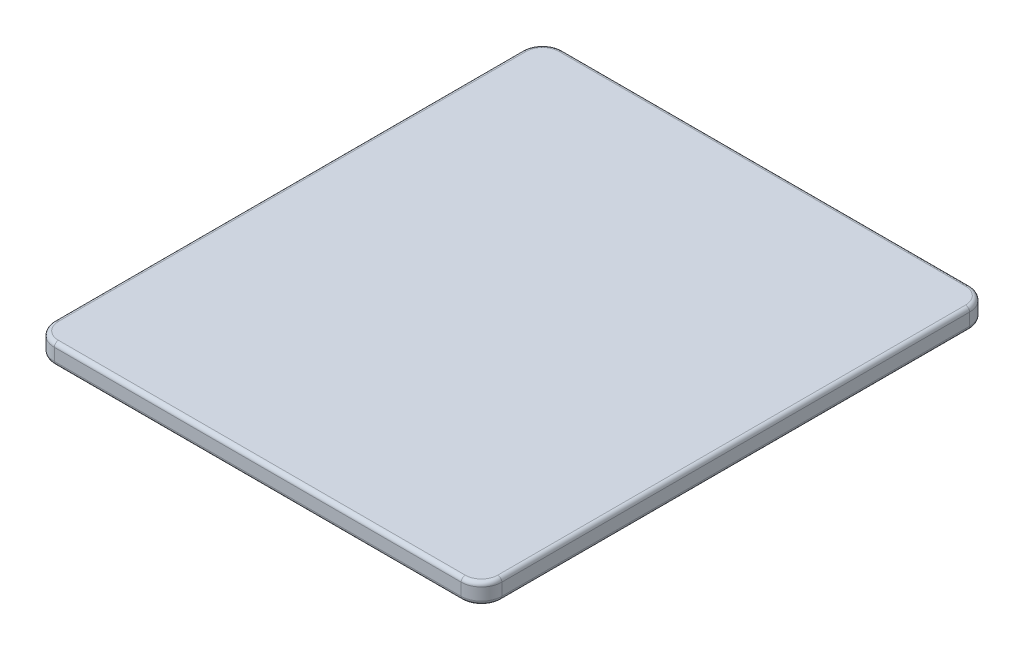
ISO-10303-21;
HEADER;
FILE_DESCRIPTION(('STEP AP214'),'2;1');
FILE_NAME('part.step','',(''),(''),'','','');
FILE_SCHEMA(('AUTOMOTIVE_DESIGN { 1 0 10303 214 1 1 1 1 }'));
ENDSEC;
DATA;
#1=APPLICATION_CONTEXT('core data for automotive mechanical design processes');
#2=APPLICATION_PROTOCOL_DEFINITION('international standard','automotive_design',2000,#1);
#3=PRODUCT_CONTEXT('',#1,'mechanical');
#4=PRODUCT('Part','Part','',(#3));
#5=PRODUCT_RELATED_PRODUCT_CATEGORY('part','',(#4));
#6=PRODUCT_DEFINITION_FORMATION('','',#4);
#7=PRODUCT_DEFINITION_CONTEXT('part definition',#1,'design');
#8=PRODUCT_DEFINITION('design','',#6,#7);
#9=PRODUCT_DEFINITION_SHAPE('','',#8);
#10=(LENGTH_UNIT() NAMED_UNIT(*) SI_UNIT(.MILLI.,.METRE.));
#11=(NAMED_UNIT(*) PLANE_ANGLE_UNIT() SI_UNIT($,.RADIAN.));
#12=(NAMED_UNIT(*) SI_UNIT($,.STERADIAN.) SOLID_ANGLE_UNIT());
#13=UNCERTAINTY_MEASURE_WITH_UNIT(LENGTH_MEASURE(1.E-05),#10,'distance_accuracy_value','');
#14=(GEOMETRIC_REPRESENTATION_CONTEXT(3) GLOBAL_UNCERTAINTY_ASSIGNED_CONTEXT((#13)) GLOBAL_UNIT_ASSIGNED_CONTEXT((#10,
#11,#12)) REPRESENTATION_CONTEXT('',''));
#15=CARTESIAN_POINT('',(0.,0.,0.));
#16=DIRECTION('',(0.,0.,1.));
#17=DIRECTION('',(1.,0.,0.));
#18=AXIS2_PLACEMENT_3D('',#15,#16,#17);
#19=CARTESIAN_POINT('',(-5.5,0.5,-6.25));
#20=DIRECTION('',(1.,0.,0.));
#21=DIRECTION('',(0.,0.,-1.));
#22=AXIS2_PLACEMENT_3D('',#19,#20,#21);
#23=PLANE('',#22);
#24=DIRECTION('',(0.,-1.,0.));
#25=VECTOR('',#24,1.);
#26=CARTESIAN_POINT('',(-5.5,0.5,5.75));
#27=LINE('',#26,#25);
#28=CARTESIAN_POINT('',(-5.5,0.1,5.75));
#29=VERTEX_POINT('',#28);
#30=CARTESIAN_POINT('',(-5.5,0.4,5.75));
#31=VERTEX_POINT('',#30);
#32=EDGE_CURVE('E238',#29,#31,#27,.F.);
#33=ORIENTED_EDGE('',*,*,#32,.T.);
#34=DIRECTION('',(0.,0.,1.));
#35=VECTOR('',#34,1.);
#36=CARTESIAN_POINT('',(-5.5,0.4,-5.75));
#37=LINE('',#36,#35);
#38=CARTESIAN_POINT('',(-5.5,0.4,-5.75));
#39=VERTEX_POINT('',#38);
#40=EDGE_CURVE('E184',#31,#39,#37,.F.);
#41=ORIENTED_EDGE('',*,*,#40,.T.);
#42=DIRECTION('',(0.,-1.,0.));
#43=VECTOR('',#42,1.);
#44=CARTESIAN_POINT('',(-5.5,0.5,-5.75));
#45=LINE('',#44,#43);
#46=CARTESIAN_POINT('',(-5.5,0.1,-5.75));
#47=VERTEX_POINT('',#46);
#48=EDGE_CURVE('E285',#39,#47,#45,.T.);
#49=ORIENTED_EDGE('',*,*,#48,.T.);
#50=DIRECTION('',(0.,0.,1.));
#51=VECTOR('',#50,1.);
#52=CARTESIAN_POINT('',(-5.5,0.1,-6.25));
#53=LINE('',#52,#51);
#54=EDGE_CURVE('E182',#47,#29,#53,.T.);
#55=ORIENTED_EDGE('',*,*,#54,.T.);
#56=EDGE_LOOP('',(#33,#41,#49,#55));
#57=FACE_BOUND('',#56,.T.);
#58=ADVANCED_FACE('F33',(#57),#23,.F.);
#59=CARTESIAN_POINT('',(-5.5,0.5,6.25));
#60=DIRECTION('',(0.,0.,-1.));
#61=DIRECTION('',(-1.,0.,0.));
#62=AXIS2_PLACEMENT_3D('',#59,#60,#61);
#63=PLANE('',#62);
#64=DIRECTION('',(0.,-1.,0.));
#65=VECTOR('',#64,1.);
#66=CARTESIAN_POINT('',(-5.,0.5,6.25));
#67=LINE('',#66,#65);
#68=CARTESIAN_POINT('',(-5.,0.4,6.25));
#69=VERTEX_POINT('',#68);
#70=CARTESIAN_POINT('',(-5.,0.1,6.25));
#71=VERTEX_POINT('',#70);
#72=EDGE_CURVE('E167',#69,#71,#67,.T.);
#73=ORIENTED_EDGE('',*,*,#72,.T.);
#74=DIRECTION('',(1.,0.,0.));
#75=VECTOR('',#74,1.);
#76=CARTESIAN_POINT('',(-5.5,0.1,6.25));
#77=LINE('',#76,#75);
#78=CARTESIAN_POINT('',(5.,0.1,6.25));
#79=VERTEX_POINT('',#78);
#80=EDGE_CURVE('E11',#71,#79,#77,.T.);
#81=ORIENTED_EDGE('',*,*,#80,.T.);
#82=DIRECTION('',(0.,-1.,0.));
#83=VECTOR('',#82,1.);
#84=CARTESIAN_POINT('',(5.,0.5,6.25));
#85=LINE('',#84,#83);
#86=CARTESIAN_POINT('',(5.,0.4,6.25));
#87=VERTEX_POINT('',#86);
#88=EDGE_CURVE('E296',#79,#87,#85,.F.);
#89=ORIENTED_EDGE('',*,*,#88,.T.);
#90=DIRECTION('',(1.,0.,0.));
#91=VECTOR('',#90,1.);
#92=CARTESIAN_POINT('',(-5.,0.4,6.25));
#93=LINE('',#92,#91);
#94=EDGE_CURVE('E42',#87,#69,#93,.F.);
#95=ORIENTED_EDGE('',*,*,#94,.T.);
#96=EDGE_LOOP('',(#73,#81,#89,#95));
#97=FACE_BOUND('',#96,.T.);
#98=ADVANCED_FACE('F336',(#97),#63,.F.);
#99=CARTESIAN_POINT('',(5.5,0.5,-6.25));
#100=DIRECTION('',(-1.,0.,0.));
#101=DIRECTION('',(0.,0.,1.));
#102=AXIS2_PLACEMENT_3D('',#99,#100,#101);
#103=PLANE('',#102);
#104=DIRECTION('',(0.,-1.,0.));
#105=VECTOR('',#104,1.);
#106=CARTESIAN_POINT('',(5.5,0.5,-5.75));
#107=LINE('',#106,#105);
#108=CARTESIAN_POINT('',(5.5,0.1,-5.75));
#109=VERTEX_POINT('',#108);
#110=CARTESIAN_POINT('',(5.5,0.4,-5.75));
#111=VERTEX_POINT('',#110);
#112=EDGE_CURVE('E278',#109,#111,#107,.F.);
#113=ORIENTED_EDGE('',*,*,#112,.T.);
#114=DIRECTION('',(0.,0.,-1.));
#115=VECTOR('',#114,1.);
#116=CARTESIAN_POINT('',(5.5,0.4,5.75));
#117=LINE('',#116,#115);
#118=CARTESIAN_POINT('',(5.5,0.4,5.75));
#119=VERTEX_POINT('',#118);
#120=EDGE_CURVE('E200',#111,#119,#117,.F.);
#121=ORIENTED_EDGE('',*,*,#120,.T.);
#122=DIRECTION('',(0.,-1.,0.));
#123=VECTOR('',#122,1.);
#124=CARTESIAN_POINT('',(5.5,0.5,5.75));
#125=LINE('',#124,#123);
#126=CARTESIAN_POINT('',(5.5,0.1,5.75));
#127=VERTEX_POINT('',#126);
#128=EDGE_CURVE('E287',#119,#127,#125,.T.);
#129=ORIENTED_EDGE('',*,*,#128,.T.);
#130=DIRECTION('',(0.,0.,-1.));
#131=VECTOR('',#130,1.);
#132=CARTESIAN_POINT('',(5.5,0.1,-6.25));
#133=LINE('',#132,#131);
#134=EDGE_CURVE('E198',#127,#109,#133,.T.);
#135=ORIENTED_EDGE('',*,*,#134,.T.);
#136=EDGE_LOOP('',(#113,#121,#129,#135));
#137=FACE_BOUND('',#136,.T.);
#138=ADVANCED_FACE('F369',(#137),#103,.F.);
#139=CARTESIAN_POINT('',(-5.5,0.5,-6.25));
#140=DIRECTION('',(0.,0.,1.));
#141=DIRECTION('',(1.,0.,0.));
#142=AXIS2_PLACEMENT_3D('',#139,#140,#141);
#143=PLANE('',#142);
#144=DIRECTION('',(0.,-1.,0.));
#145=VECTOR('',#144,1.);
#146=CARTESIAN_POINT('',(-5.,0.5,-6.25));
#147=LINE('',#146,#145);
#148=CARTESIAN_POINT('',(-5.,0.1,-6.25));
#149=VERTEX_POINT('',#148);
#150=CARTESIAN_POINT('',(-5.,0.4,-6.25));
#151=VERTEX_POINT('',#150);
#152=EDGE_CURVE('E284',#149,#151,#147,.F.);
#153=ORIENTED_EDGE('',*,*,#152,.T.);
#154=DIRECTION('',(-1.,0.,0.));
#155=VECTOR('',#154,1.);
#156=CARTESIAN_POINT('',(5.,0.4,-6.25));
#157=LINE('',#156,#155);
#158=CARTESIAN_POINT('',(5.,0.4,-6.25));
#159=VERTEX_POINT('',#158);
#160=EDGE_CURVE('E192',#151,#159,#157,.F.);
#161=ORIENTED_EDGE('',*,*,#160,.T.);
#162=DIRECTION('',(0.,-1.,0.));
#163=VECTOR('',#162,1.);
#164=CARTESIAN_POINT('',(5.,0.5,-6.25));
#165=LINE('',#164,#163);
#166=CARTESIAN_POINT('',(5.,0.1,-6.25));
#167=VERTEX_POINT('',#166);
#168=EDGE_CURVE('E275',#159,#167,#165,.T.);
#169=ORIENTED_EDGE('',*,*,#168,.T.);
#170=DIRECTION('',(-1.,0.,0.));
#171=VECTOR('',#170,1.);
#172=CARTESIAN_POINT('',(-5.5,0.1,-6.25));
#173=LINE('',#172,#171);
#174=EDGE_CURVE('E190',#167,#149,#173,.T.);
#175=ORIENTED_EDGE('',*,*,#174,.T.);
#176=EDGE_LOOP('',(#153,#161,#169,#175));
#177=FACE_BOUND('',#176,.T.);
#178=ADVANCED_FACE('F281',(#177),#143,.F.);
#179=CARTESIAN_POINT('',(0.,0.5,0.));
#180=DIRECTION('',(0.,1.,0.));
#181=DIRECTION('',(0.,0.,1.));
#182=AXIS2_PLACEMENT_3D('',#179,#180,#181);
#183=PLANE('',#182);
#184=DIRECTION('',(0.,0.,1.));
#185=VECTOR('',#184,1.);
#186=CARTESIAN_POINT('',(-5.4,0.5,5.75));
#187=LINE('',#186,#185);
#188=CARTESIAN_POINT('',(-5.4,0.5,-5.75));
#189=VERTEX_POINT('',#188);
#190=CARTESIAN_POINT('',(-5.4,0.5,5.75));
#191=VERTEX_POINT('',#190);
#192=EDGE_CURVE('E171',#189,#191,#187,.T.);
#193=ORIENTED_EDGE('',*,*,#192,.T.);
#194=CARTESIAN_POINT('',(-5.,0.5,5.75));
#195=DIRECTION('',(0.,1.,0.));
#196=DIRECTION('',(0.,0.,1.));
#197=AXIS2_PLACEMENT_3D('',#194,#195,#196);
#198=CIRCLE('',#197,0.4);
#199=CARTESIAN_POINT('',(-5.,0.5,6.15));
#200=VERTEX_POINT('',#199);
#201=EDGE_CURVE('E152',#191,#200,#198,.T.);
#202=ORIENTED_EDGE('',*,*,#201,.T.);
#203=DIRECTION('',(1.,0.,0.));
#204=VECTOR('',#203,1.);
#205=CARTESIAN_POINT('',(5.,0.5,6.15));
#206=LINE('',#205,#204);
#207=CARTESIAN_POINT('',(5.,0.5,6.15));
#208=VERTEX_POINT('',#207);
#209=EDGE_CURVE('E160',#200,#208,#206,.T.);
#210=ORIENTED_EDGE('',*,*,#209,.T.);
#211=CARTESIAN_POINT('',(5.,0.5,5.75));
#212=DIRECTION('',(0.,1.,0.));
#213=DIRECTION('',(0.,0.,1.));
#214=AXIS2_PLACEMENT_3D('',#211,#212,#213);
#215=CIRCLE('',#214,0.4);
#216=CARTESIAN_POINT('',(5.4,0.5,5.75));
#217=VERTEX_POINT('',#216);
#218=EDGE_CURVE('E166',#208,#217,#215,.T.);
#219=ORIENTED_EDGE('',*,*,#218,.T.);
#220=DIRECTION('',(0.,0.,-1.));
#221=VECTOR('',#220,1.);
#222=CARTESIAN_POINT('',(5.4,0.5,-5.75));
#223=LINE('',#222,#221);
#224=CARTESIAN_POINT('',(5.4,0.5,-5.75));
#225=VERTEX_POINT('',#224);
#226=EDGE_CURVE('E302',#217,#225,#223,.T.);
#227=ORIENTED_EDGE('',*,*,#226,.T.);
#228=CARTESIAN_POINT('',(5.,0.5,-5.75));
#229=DIRECTION('',(0.,1.,0.));
#230=DIRECTION('',(0.,0.,1.));
#231=AXIS2_PLACEMENT_3D('',#228,#229,#230);
#232=CIRCLE('',#231,0.4);
#233=CARTESIAN_POINT('',(5.,0.5,-6.15));
#234=VERTEX_POINT('',#233);
#235=EDGE_CURVE('E304',#225,#234,#232,.T.);
#236=ORIENTED_EDGE('',*,*,#235,.T.);
#237=DIRECTION('',(-1.,0.,0.));
#238=VECTOR('',#237,1.);
#239=CARTESIAN_POINT('',(-5.,0.5,-6.15));
#240=LINE('',#239,#238);
#241=CARTESIAN_POINT('',(-5.,0.5,-6.15));
#242=VERTEX_POINT('',#241);
#243=EDGE_CURVE('E306',#234,#242,#240,.T.);
#244=ORIENTED_EDGE('',*,*,#243,.T.);
#245=CARTESIAN_POINT('',(-5.,0.5,-5.75));
#246=DIRECTION('',(0.,1.,0.));
#247=DIRECTION('',(0.,0.,1.));
#248=AXIS2_PLACEMENT_3D('',#245,#246,#247);
#249=CIRCLE('',#248,0.4);
#250=EDGE_CURVE('E177',#242,#189,#249,.T.);
#251=ORIENTED_EDGE('',*,*,#250,.T.);
#252=EDGE_LOOP('',(#193,#202,#210,#219,#227,#236,#244,#251));
#253=FACE_BOUND('',#252,.T.);
#254=ADVANCED_FACE('F169',(#253),#183,.T.);
#255=CARTESIAN_POINT('',(0.,0.,0.));
#256=DIRECTION('',(0.,1.,0.));
#257=DIRECTION('',(0.,0.,1.));
#258=AXIS2_PLACEMENT_3D('',#255,#256,#257);
#259=PLANE('',#258);
#260=DIRECTION('',(1.,0.,0.));
#261=VECTOR('',#260,1.);
#262=CARTESIAN_POINT('',(0.,0.,6.15));
#263=LINE('',#262,#261);
#264=CARTESIAN_POINT('',(5.,0.,6.15));
#265=VERTEX_POINT('',#264);
#266=CARTESIAN_POINT('',(-5.,0.,6.15));
#267=VERTEX_POINT('',#266);
#268=EDGE_CURVE('E50',#265,#267,#263,.F.);
#269=ORIENTED_EDGE('',*,*,#268,.T.);
#270=CARTESIAN_POINT('',(-5.,0.,5.75));
#271=DIRECTION('',(0.,1.,0.));
#272=DIRECTION('',(0.,0.,1.));
#273=AXIS2_PLACEMENT_3D('',#270,#271,#272);
#274=CIRCLE('',#273,0.4);
#275=CARTESIAN_POINT('',(-5.4,0.,5.75));
#276=VERTEX_POINT('',#275);
#277=EDGE_CURVE('E218',#267,#276,#274,.F.);
#278=ORIENTED_EDGE('',*,*,#277,.T.);
#279=DIRECTION('',(0.,0.,1.));
#280=VECTOR('',#279,1.);
#281=CARTESIAN_POINT('',(-5.4,0.,0.));
#282=LINE('',#281,#280);
#283=CARTESIAN_POINT('',(-5.4,0.,-5.75));
#284=VERTEX_POINT('',#283);
#285=EDGE_CURVE('E206',#276,#284,#282,.F.);
#286=ORIENTED_EDGE('',*,*,#285,.T.);
#287=CARTESIAN_POINT('',(-5.,0.,-5.75));
#288=DIRECTION('',(0.,1.,0.));
#289=DIRECTION('',(0.,0.,1.));
#290=AXIS2_PLACEMENT_3D('',#287,#288,#289);
#291=CIRCLE('',#290,0.4);
#292=CARTESIAN_POINT('',(-5.,0.,-6.15));
#293=VERTEX_POINT('',#292);
#294=EDGE_CURVE('E208',#284,#293,#291,.F.);
#295=ORIENTED_EDGE('',*,*,#294,.T.);
#296=DIRECTION('',(-1.,0.,0.));
#297=VECTOR('',#296,1.);
#298=CARTESIAN_POINT('',(0.,0.,-6.15));
#299=LINE('',#298,#297);
#300=CARTESIAN_POINT('',(5.,0.,-6.15));
#301=VERTEX_POINT('',#300);
#302=EDGE_CURVE('E210',#293,#301,#299,.F.);
#303=ORIENTED_EDGE('',*,*,#302,.T.);
#304=CARTESIAN_POINT('',(5.,0.,-5.75));
#305=DIRECTION('',(0.,1.,0.));
#306=DIRECTION('',(0.,0.,1.));
#307=AXIS2_PLACEMENT_3D('',#304,#305,#306);
#308=CIRCLE('',#307,0.4);
#309=CARTESIAN_POINT('',(5.4,0.,-5.75));
#310=VERTEX_POINT('',#309);
#311=EDGE_CURVE('E212',#301,#310,#308,.F.);
#312=ORIENTED_EDGE('',*,*,#311,.T.);
#313=DIRECTION('',(0.,0.,-1.));
#314=VECTOR('',#313,1.);
#315=CARTESIAN_POINT('',(5.4,0.,0.));
#316=LINE('',#315,#314);
#317=CARTESIAN_POINT('',(5.4,0.,5.75));
#318=VERTEX_POINT('',#317);
#319=EDGE_CURVE('E214',#310,#318,#316,.F.);
#320=ORIENTED_EDGE('',*,*,#319,.T.);
#321=CARTESIAN_POINT('',(5.,0.,5.75));
#322=DIRECTION('',(0.,1.,0.));
#323=DIRECTION('',(0.,0.,1.));
#324=AXIS2_PLACEMENT_3D('',#321,#322,#323);
#325=CIRCLE('',#324,0.4);
#326=EDGE_CURVE('E55',#318,#265,#325,.F.);
#327=ORIENTED_EDGE('',*,*,#326,.T.);
#328=EDGE_LOOP('',(#269,#278,#286,#295,#303,#312,#320,#327));
#329=FACE_BOUND('',#328,.T.);
#330=ADVANCED_FACE('F376',(#329),#259,.F.);
#331=CARTESIAN_POINT('',(-5.,0.5,-5.75));
#332=DIRECTION('',(0.,-1.,0.));
#333=DIRECTION('',(0.,0.,-1.));
#334=AXIS2_PLACEMENT_3D('',#331,#332,#333);
#335=CYLINDRICAL_SURFACE('',#334,0.5);
#336=ORIENTED_EDGE('',*,*,#48,.F.);
#337=CARTESIAN_POINT('',(-5.,0.4,-5.75));
#338=DIRECTION('',(0.,1.,0.));
#339=DIRECTION('',(0.,0.,1.));
#340=AXIS2_PLACEMENT_3D('',#337,#338,#339);
#341=CIRCLE('',#340,0.5);
#342=EDGE_CURVE('E188',#39,#151,#341,.F.);
#343=ORIENTED_EDGE('',*,*,#342,.T.);
#344=ORIENTED_EDGE('',*,*,#152,.F.);
#345=CARTESIAN_POINT('',(-5.,0.1,-5.75));
#346=DIRECTION('',(0.,1.,0.));
#347=DIRECTION('',(0.,0.,1.));
#348=AXIS2_PLACEMENT_3D('',#345,#346,#347);
#349=CIRCLE('',#348,0.5);
#350=EDGE_CURVE('E186',#149,#47,#349,.T.);
#351=ORIENTED_EDGE('',*,*,#350,.T.);
#352=EDGE_LOOP('',(#336,#343,#344,#351));
#353=FACE_BOUND('',#352,.T.);
#354=ADVANCED_FACE('F373',(#353),#335,.T.);
#355=CARTESIAN_POINT('',(5.,0.5,-5.75));
#356=DIRECTION('',(0.,-1.,0.));
#357=DIRECTION('',(0.,0.,-1.));
#358=AXIS2_PLACEMENT_3D('',#355,#356,#357);
#359=CYLINDRICAL_SURFACE('',#358,0.5);
#360=ORIENTED_EDGE('',*,*,#168,.F.);
#361=CARTESIAN_POINT('',(5.,0.4,-5.75));
#362=DIRECTION('',(0.,1.,0.));
#363=DIRECTION('',(0.,0.,1.));
#364=AXIS2_PLACEMENT_3D('',#361,#362,#363);
#365=CIRCLE('',#364,0.5);
#366=EDGE_CURVE('E196',#159,#111,#365,.F.);
#367=ORIENTED_EDGE('',*,*,#366,.T.);
#368=ORIENTED_EDGE('',*,*,#112,.F.);
#369=CARTESIAN_POINT('',(5.,0.1,-5.75));
#370=DIRECTION('',(0.,1.,0.));
#371=DIRECTION('',(0.,0.,1.));
#372=AXIS2_PLACEMENT_3D('',#369,#370,#371);
#373=CIRCLE('',#372,0.5);
#374=EDGE_CURVE('E194',#109,#167,#373,.T.);
#375=ORIENTED_EDGE('',*,*,#374,.T.);
#376=EDGE_LOOP('',(#360,#367,#368,#375));
#377=FACE_BOUND('',#376,.T.);
#378=ADVANCED_FACE('F274',(#377),#359,.T.);
#379=CARTESIAN_POINT('',(-5.,0.5,5.75));
#380=DIRECTION('',(0.,-1.,0.));
#381=DIRECTION('',(0.,0.,-1.));
#382=AXIS2_PLACEMENT_3D('',#379,#380,#381);
#383=CYLINDRICAL_SURFACE('',#382,0.5);
#384=ORIENTED_EDGE('',*,*,#72,.F.);
#385=CARTESIAN_POINT('',(-5.,0.4,5.75));
#386=DIRECTION('',(0.,1.,0.));
#387=DIRECTION('',(0.,0.,1.));
#388=AXIS2_PLACEMENT_3D('',#385,#386,#387);
#389=CIRCLE('',#388,0.5);
#390=EDGE_CURVE('E154',#69,#31,#389,.F.);
#391=ORIENTED_EDGE('',*,*,#390,.T.);
#392=ORIENTED_EDGE('',*,*,#32,.F.);
#393=CARTESIAN_POINT('',(-5.,0.1,5.75));
#394=DIRECTION('',(0.,1.,0.));
#395=DIRECTION('',(0.,0.,1.));
#396=AXIS2_PLACEMENT_3D('',#393,#394,#395);
#397=CIRCLE('',#396,0.5);
#398=EDGE_CURVE('E173',#29,#71,#397,.T.);
#399=ORIENTED_EDGE('',*,*,#398,.T.);
#400=EDGE_LOOP('',(#384,#391,#392,#399));
#401=FACE_BOUND('',#400,.T.);
#402=ADVANCED_FACE('F323',(#401),#383,.T.);
#403=CARTESIAN_POINT('',(5.,0.5,5.75));
#404=DIRECTION('',(0.,-1.,0.));
#405=DIRECTION('',(0.,0.,-1.));
#406=AXIS2_PLACEMENT_3D('',#403,#404,#405);
#407=CYLINDRICAL_SURFACE('',#406,0.5);
#408=ORIENTED_EDGE('',*,*,#128,.F.);
#409=CARTESIAN_POINT('',(5.,0.4,5.75));
#410=DIRECTION('',(0.,1.,0.));
#411=DIRECTION('',(0.,0.,1.));
#412=AXIS2_PLACEMENT_3D('',#409,#410,#411);
#413=CIRCLE('',#412,0.5);
#414=EDGE_CURVE('E204',#119,#87,#413,.F.);
#415=ORIENTED_EDGE('',*,*,#414,.T.);
#416=ORIENTED_EDGE('',*,*,#88,.F.);
#417=CARTESIAN_POINT('',(5.,0.1,5.75));
#418=DIRECTION('',(0.,1.,0.));
#419=DIRECTION('',(0.,0.,1.));
#420=AXIS2_PLACEMENT_3D('',#417,#418,#419);
#421=CIRCLE('',#420,0.5);
#422=EDGE_CURVE('E202',#79,#127,#421,.T.);
#423=ORIENTED_EDGE('',*,*,#422,.T.);
#424=EDGE_LOOP('',(#408,#415,#416,#423));
#425=FACE_BOUND('',#424,.T.);
#426=ADVANCED_FACE('F362',(#425),#407,.T.);
#427=CARTESIAN_POINT('',(5.,0.4,-5.75));
#428=DIRECTION('',(0.,1.,0.));
#429=DIRECTION('',(0.,0.,1.));
#430=AXIS2_PLACEMENT_3D('',#427,#428,#429);
#431=TOROIDAL_SURFACE('',#430,0.4,0.1);
#432=CARTESIAN_POINT('',(5.4,0.4,-5.75));
#433=DIRECTION('',(0.,0.,1.));
#434=DIRECTION('',(1.,0.,0.));
#435=AXIS2_PLACEMENT_3D('',#432,#433,#434);
#436=CIRCLE('',#435,0.1);
#437=EDGE_CURVE('E232',#111,#225,#436,.T.);
#438=ORIENTED_EDGE('',*,*,#437,.F.);
#439=ORIENTED_EDGE('',*,*,#366,.F.);
#440=CARTESIAN_POINT('',(5.,0.4,-6.15));
#441=DIRECTION('',(-1.,0.,0.));
#442=DIRECTION('',(0.,0.,1.));
#443=AXIS2_PLACEMENT_3D('',#440,#441,#442);
#444=CIRCLE('',#443,0.1);
#445=EDGE_CURVE('E235',#234,#159,#444,.T.);
#446=ORIENTED_EDGE('',*,*,#445,.F.);
#447=ORIENTED_EDGE('',*,*,#235,.F.);
#448=EDGE_LOOP('',(#438,#439,#446,#447));
#449=FACE_BOUND('',#448,.T.);
#450=ADVANCED_FACE('F351',(#449),#431,.T.);
#451=CARTESIAN_POINT('',(0.,0.4,-6.15));
#452=DIRECTION('',(1.,0.,0.));
#453=DIRECTION('',(0.,0.,-1.));
#454=AXIS2_PLACEMENT_3D('',#451,#452,#453);
#455=CYLINDRICAL_SURFACE('',#454,0.1);
#456=ORIENTED_EDGE('',*,*,#445,.T.);
#457=ORIENTED_EDGE('',*,*,#160,.F.);
#458=CARTESIAN_POINT('',(-5.,0.4,-6.15));
#459=DIRECTION('',(-1.,0.,0.));
#460=DIRECTION('',(0.,0.,1.));
#461=AXIS2_PLACEMENT_3D('',#458,#459,#460);
#462=CIRCLE('',#461,0.1);
#463=EDGE_CURVE('E229',#242,#151,#462,.T.);
#464=ORIENTED_EDGE('',*,*,#463,.F.);
#465=ORIENTED_EDGE('',*,*,#243,.F.);
#466=EDGE_LOOP('',(#456,#457,#464,#465));
#467=FACE_BOUND('',#466,.T.);
#468=ADVANCED_FACE('F354',(#467),#455,.T.);
#469=CARTESIAN_POINT('',(5.4,0.4,0.));
#470=DIRECTION('',(0.,0.,1.));
#471=DIRECTION('',(1.,0.,0.));
#472=AXIS2_PLACEMENT_3D('',#469,#470,#471);
#473=CYLINDRICAL_SURFACE('',#472,0.1);
#474=ORIENTED_EDGE('',*,*,#437,.T.);
#475=ORIENTED_EDGE('',*,*,#226,.F.);
#476=CARTESIAN_POINT('',(5.4,0.4,5.75));
#477=DIRECTION('',(0.,0.,1.));
#478=DIRECTION('',(1.,0.,0.));
#479=AXIS2_PLACEMENT_3D('',#476,#477,#478);
#480=CIRCLE('',#479,0.1);
#481=EDGE_CURVE('E226',#119,#217,#480,.T.);
#482=ORIENTED_EDGE('',*,*,#481,.F.);
#483=ORIENTED_EDGE('',*,*,#120,.F.);
#484=EDGE_LOOP('',(#474,#475,#482,#483));
#485=FACE_BOUND('',#484,.T.);
#486=ADVANCED_FACE('F347',(#485),#473,.T.);
#487=CARTESIAN_POINT('',(-5.,0.4,-5.75));
#488=DIRECTION('',(0.,1.,0.));
#489=DIRECTION('',(0.,0.,1.));
#490=AXIS2_PLACEMENT_3D('',#487,#488,#489);
#491=TOROIDAL_SURFACE('',#490,0.4,0.1);
#492=ORIENTED_EDGE('',*,*,#463,.T.);
#493=ORIENTED_EDGE('',*,*,#342,.F.);
#494=CARTESIAN_POINT('',(-5.4,0.4,-5.75));
#495=DIRECTION('',(0.,0.,1.));
#496=DIRECTION('',(1.,0.,0.));
#497=AXIS2_PLACEMENT_3D('',#494,#495,#496);
#498=CIRCLE('',#497,0.1);
#499=EDGE_CURVE('E223',#189,#39,#498,.T.);
#500=ORIENTED_EDGE('',*,*,#499,.F.);
#501=ORIENTED_EDGE('',*,*,#250,.F.);
#502=EDGE_LOOP('',(#492,#493,#500,#501));
#503=FACE_BOUND('',#502,.T.);
#504=ADVANCED_FACE('F313',(#503),#491,.T.);
#505=CARTESIAN_POINT('',(5.,0.4,5.75));
#506=DIRECTION('',(0.,1.,0.));
#507=DIRECTION('',(0.,0.,1.));
#508=AXIS2_PLACEMENT_3D('',#505,#506,#507);
#509=TOROIDAL_SURFACE('',#508,0.4,0.1);
#510=ORIENTED_EDGE('',*,*,#481,.T.);
#511=ORIENTED_EDGE('',*,*,#218,.F.);
#512=CARTESIAN_POINT('',(5.,0.4,6.15));
#513=DIRECTION('',(-1.,0.,0.));
#514=DIRECTION('',(0.,0.,1.));
#515=AXIS2_PLACEMENT_3D('',#512,#513,#514);
#516=CIRCLE('',#515,0.1);
#517=EDGE_CURVE('E163',#87,#208,#516,.T.);
#518=ORIENTED_EDGE('',*,*,#517,.F.);
#519=ORIENTED_EDGE('',*,*,#414,.F.);
#520=EDGE_LOOP('',(#510,#511,#518,#519));
#521=FACE_BOUND('',#520,.T.);
#522=ADVANCED_FACE('F342',(#521),#509,.T.);
#523=CARTESIAN_POINT('',(-5.4,0.4,0.));
#524=DIRECTION('',(0.,0.,-1.));
#525=DIRECTION('',(-1.,0.,0.));
#526=AXIS2_PLACEMENT_3D('',#523,#524,#525);
#527=CYLINDRICAL_SURFACE('',#526,0.1);
#528=ORIENTED_EDGE('',*,*,#499,.T.);
#529=ORIENTED_EDGE('',*,*,#40,.F.);
#530=CARTESIAN_POINT('',(-5.4,0.4,5.75));
#531=DIRECTION('',(0.,0.,1.));
#532=DIRECTION('',(1.,0.,0.));
#533=AXIS2_PLACEMENT_3D('',#530,#531,#532);
#534=CIRCLE('',#533,0.1);
#535=EDGE_CURVE('E157',#191,#31,#534,.T.);
#536=ORIENTED_EDGE('',*,*,#535,.F.);
#537=ORIENTED_EDGE('',*,*,#192,.F.);
#538=EDGE_LOOP('',(#528,#529,#536,#537));
#539=FACE_BOUND('',#538,.T.);
#540=ADVANCED_FACE('F316',(#539),#527,.T.);
#541=CARTESIAN_POINT('',(0.,0.4,6.15));
#542=DIRECTION('',(-1.,0.,0.));
#543=DIRECTION('',(0.,0.,1.));
#544=AXIS2_PLACEMENT_3D('',#541,#542,#543);
#545=CYLINDRICAL_SURFACE('',#544,0.1);
#546=ORIENTED_EDGE('',*,*,#517,.T.);
#547=ORIENTED_EDGE('',*,*,#209,.F.);
#548=CARTESIAN_POINT('',(-5.,0.4,6.15));
#549=DIRECTION('',(-1.,0.,0.));
#550=DIRECTION('',(0.,0.,1.));
#551=AXIS2_PLACEMENT_3D('',#548,#549,#550);
#552=CIRCLE('',#551,0.1);
#553=EDGE_CURVE('E148',#69,#200,#552,.T.);
#554=ORIENTED_EDGE('',*,*,#553,.F.);
#555=ORIENTED_EDGE('',*,*,#94,.F.);
#556=EDGE_LOOP('',(#546,#547,#554,#555));
#557=FACE_BOUND('',#556,.T.);
#558=ADVANCED_FACE('F161',(#557),#545,.T.);
#559=CARTESIAN_POINT('',(-5.,0.4,5.75));
#560=DIRECTION('',(0.,1.,0.));
#561=DIRECTION('',(0.,0.,1.));
#562=AXIS2_PLACEMENT_3D('',#559,#560,#561);
#563=TOROIDAL_SURFACE('',#562,0.4,0.1);
#564=ORIENTED_EDGE('',*,*,#535,.T.);
#565=ORIENTED_EDGE('',*,*,#390,.F.);
#566=ORIENTED_EDGE('',*,*,#553,.T.);
#567=ORIENTED_EDGE('',*,*,#201,.F.);
#568=EDGE_LOOP('',(#564,#565,#566,#567));
#569=FACE_BOUND('',#568,.T.);
#570=ADVANCED_FACE('F150',(#569),#563,.T.);
#571=CARTESIAN_POINT('',(5.,0.1,-5.75));
#572=DIRECTION('',(0.,1.,0.));
#573=DIRECTION('',(0.,0.,1.));
#574=AXIS2_PLACEMENT_3D('',#571,#572,#573);
#575=TOROIDAL_SURFACE('',#574,0.4,0.1);
#576=CARTESIAN_POINT('',(5.,0.1,-6.15));
#577=DIRECTION('',(-1.,0.,0.));
#578=DIRECTION('',(0.,0.,1.));
#579=AXIS2_PLACEMENT_3D('',#576,#577,#578);
#580=CIRCLE('',#579,0.1);
#581=EDGE_CURVE('E254',#167,#301,#580,.T.);
#582=ORIENTED_EDGE('',*,*,#581,.F.);
#583=ORIENTED_EDGE('',*,*,#374,.F.);
#584=CARTESIAN_POINT('',(5.4,0.1,-5.75));
#585=DIRECTION('',(0.,0.,1.));
#586=DIRECTION('',(1.,0.,0.));
#587=AXIS2_PLACEMENT_3D('',#584,#585,#586);
#588=CIRCLE('',#587,0.1);
#589=EDGE_CURVE('E37',#310,#109,#588,.T.);
#590=ORIENTED_EDGE('',*,*,#589,.F.);
#591=ORIENTED_EDGE('',*,*,#311,.F.);
#592=EDGE_LOOP('',(#582,#583,#590,#591));
#593=FACE_BOUND('',#592,.T.);
#594=ADVANCED_FACE('F35',(#593),#575,.T.);
#595=CARTESIAN_POINT('',(5.4,0.1,-6.25));
#596=DIRECTION('',(0.,0.,-1.));
#597=DIRECTION('',(-1.,0.,0.));
#598=AXIS2_PLACEMENT_3D('',#595,#596,#597);
#599=CYLINDRICAL_SURFACE('',#598,0.1);
#600=ORIENTED_EDGE('',*,*,#589,.T.);
#601=ORIENTED_EDGE('',*,*,#134,.F.);
#602=CARTESIAN_POINT('',(5.4,0.1,5.75));
#603=DIRECTION('',(0.,0.,1.));
#604=DIRECTION('',(1.,0.,0.));
#605=AXIS2_PLACEMENT_3D('',#602,#603,#604);
#606=CIRCLE('',#605,0.1);
#607=EDGE_CURVE('E252',#318,#127,#606,.T.);
#608=ORIENTED_EDGE('',*,*,#607,.F.);
#609=ORIENTED_EDGE('',*,*,#319,.F.);
#610=EDGE_LOOP('',(#600,#601,#608,#609));
#611=FACE_BOUND('',#610,.T.);
#612=ADVANCED_FACE('F265',(#611),#599,.T.);
#613=CARTESIAN_POINT('',(-5.5,0.1,-6.15));
#614=DIRECTION('',(-1.,0.,0.));
#615=DIRECTION('',(0.,0.,1.));
#616=AXIS2_PLACEMENT_3D('',#613,#614,#615);
#617=CYLINDRICAL_SURFACE('',#616,0.1);
#618=ORIENTED_EDGE('',*,*,#581,.T.);
#619=ORIENTED_EDGE('',*,*,#302,.F.);
#620=CARTESIAN_POINT('',(-5.,0.1,-6.15));
#621=DIRECTION('',(-1.,0.,0.));
#622=DIRECTION('',(0.,0.,1.));
#623=AXIS2_PLACEMENT_3D('',#620,#621,#622);
#624=CIRCLE('',#623,0.1);
#625=EDGE_CURVE('E249',#149,#293,#624,.T.);
#626=ORIENTED_EDGE('',*,*,#625,.F.);
#627=ORIENTED_EDGE('',*,*,#174,.F.);
#628=EDGE_LOOP('',(#618,#619,#626,#627));
#629=FACE_BOUND('',#628,.T.);
#630=ADVANCED_FACE('F424',(#629),#617,.T.);
#631=CARTESIAN_POINT('',(5.,0.1,5.75));
#632=DIRECTION('',(0.,1.,0.));
#633=DIRECTION('',(0.,0.,1.));
#634=AXIS2_PLACEMENT_3D('',#631,#632,#633);
#635=TOROIDAL_SURFACE('',#634,0.4,0.1);
#636=ORIENTED_EDGE('',*,*,#607,.T.);
#637=ORIENTED_EDGE('',*,*,#422,.F.);
#638=CARTESIAN_POINT('',(5.,0.1,6.15));
#639=DIRECTION('',(-1.,0.,0.));
#640=DIRECTION('',(0.,0.,1.));
#641=AXIS2_PLACEMENT_3D('',#638,#639,#640);
#642=CIRCLE('',#641,0.1);
#643=EDGE_CURVE('E246',#265,#79,#642,.T.);
#644=ORIENTED_EDGE('',*,*,#643,.F.);
#645=ORIENTED_EDGE('',*,*,#326,.F.);
#646=EDGE_LOOP('',(#636,#637,#644,#645));
#647=FACE_BOUND('',#646,.T.);
#648=ADVANCED_FACE('F430',(#647),#635,.T.);
#649=CARTESIAN_POINT('',(-5.,0.1,-5.75));
#650=DIRECTION('',(0.,1.,0.));
#651=DIRECTION('',(0.,0.,1.));
#652=AXIS2_PLACEMENT_3D('',#649,#650,#651);
#653=TOROIDAL_SURFACE('',#652,0.4,0.1);
#654=ORIENTED_EDGE('',*,*,#625,.T.);
#655=ORIENTED_EDGE('',*,*,#294,.F.);
#656=CARTESIAN_POINT('',(-5.4,0.1,-5.75));
#657=DIRECTION('',(0.,0.,1.));
#658=DIRECTION('',(1.,0.,0.));
#659=AXIS2_PLACEMENT_3D('',#656,#657,#658);
#660=CIRCLE('',#659,0.1);
#661=EDGE_CURVE('E243',#47,#284,#660,.T.);
#662=ORIENTED_EDGE('',*,*,#661,.F.);
#663=ORIENTED_EDGE('',*,*,#350,.F.);
#664=EDGE_LOOP('',(#654,#655,#662,#663));
#665=FACE_BOUND('',#664,.T.);
#666=ADVANCED_FACE('F437',(#665),#653,.T.);
#667=CARTESIAN_POINT('',(-5.5,0.1,6.15));
#668=DIRECTION('',(1.,0.,0.));
#669=DIRECTION('',(0.,0.,-1.));
#670=AXIS2_PLACEMENT_3D('',#667,#668,#669);
#671=CYLINDRICAL_SURFACE('',#670,0.1);
#672=ORIENTED_EDGE('',*,*,#643,.T.);
#673=ORIENTED_EDGE('',*,*,#80,.F.);
#674=CARTESIAN_POINT('',(-5.,0.1,6.15));
#675=DIRECTION('',(-1.,0.,0.));
#676=DIRECTION('',(0.,0.,1.));
#677=AXIS2_PLACEMENT_3D('',#674,#675,#676);
#678=CIRCLE('',#677,0.1);
#679=EDGE_CURVE('E241',#267,#71,#678,.T.);
#680=ORIENTED_EDGE('',*,*,#679,.F.);
#681=ORIENTED_EDGE('',*,*,#268,.F.);
#682=EDGE_LOOP('',(#672,#673,#680,#681));
#683=FACE_BOUND('',#682,.T.);
#684=ADVANCED_FACE('F445',(#683),#671,.T.);
#685=CARTESIAN_POINT('',(-5.4,0.1,-6.25));
#686=DIRECTION('',(0.,0.,1.));
#687=DIRECTION('',(1.,0.,0.));
#688=AXIS2_PLACEMENT_3D('',#685,#686,#687);
#689=CYLINDRICAL_SURFACE('',#688,0.1);
#690=ORIENTED_EDGE('',*,*,#661,.T.);
#691=ORIENTED_EDGE('',*,*,#285,.F.);
#692=CARTESIAN_POINT('',(-5.4,0.1,5.75));
#693=DIRECTION('',(0.,0.,1.));
#694=DIRECTION('',(1.,0.,0.));
#695=AXIS2_PLACEMENT_3D('',#692,#693,#694);
#696=CIRCLE('',#695,0.1);
#697=EDGE_CURVE('E239',#29,#276,#696,.T.);
#698=ORIENTED_EDGE('',*,*,#697,.F.);
#699=ORIENTED_EDGE('',*,*,#54,.F.);
#700=EDGE_LOOP('',(#690,#691,#698,#699));
#701=FACE_BOUND('',#700,.T.);
#702=ADVANCED_FACE('F329',(#701),#689,.T.);
#703=CARTESIAN_POINT('',(-5.,0.1,5.75));
#704=DIRECTION('',(0.,1.,0.));
#705=DIRECTION('',(0.,0.,1.));
#706=AXIS2_PLACEMENT_3D('',#703,#704,#705);
#707=TOROIDAL_SURFACE('',#706,0.4,0.1);
#708=ORIENTED_EDGE('',*,*,#679,.T.);
#709=ORIENTED_EDGE('',*,*,#398,.F.);
#710=ORIENTED_EDGE('',*,*,#697,.T.);
#711=ORIENTED_EDGE('',*,*,#277,.F.);
#712=EDGE_LOOP('',(#708,#709,#710,#711));
#713=FACE_BOUND('',#712,.T.);
#714=ADVANCED_FACE('F333',(#713),#707,.T.);
#715=CLOSED_SHELL('',(#58,#98,#138,#178,#254,#330,#354,#378,#402,#426,#450,#468,#486,#504,#522,
#540,#558,#570,#594,#612,#630,#648,#666,#684,#702,#714));
#716=MANIFOLD_SOLID_BREP('B2',#715);
#717=ADVANCED_BREP_SHAPE_REPRESENTATION('',(#18,#716),#14);
#718=SHAPE_DEFINITION_REPRESENTATION(#9,#717);
ENDSEC;
END-ISO-10303-21;
